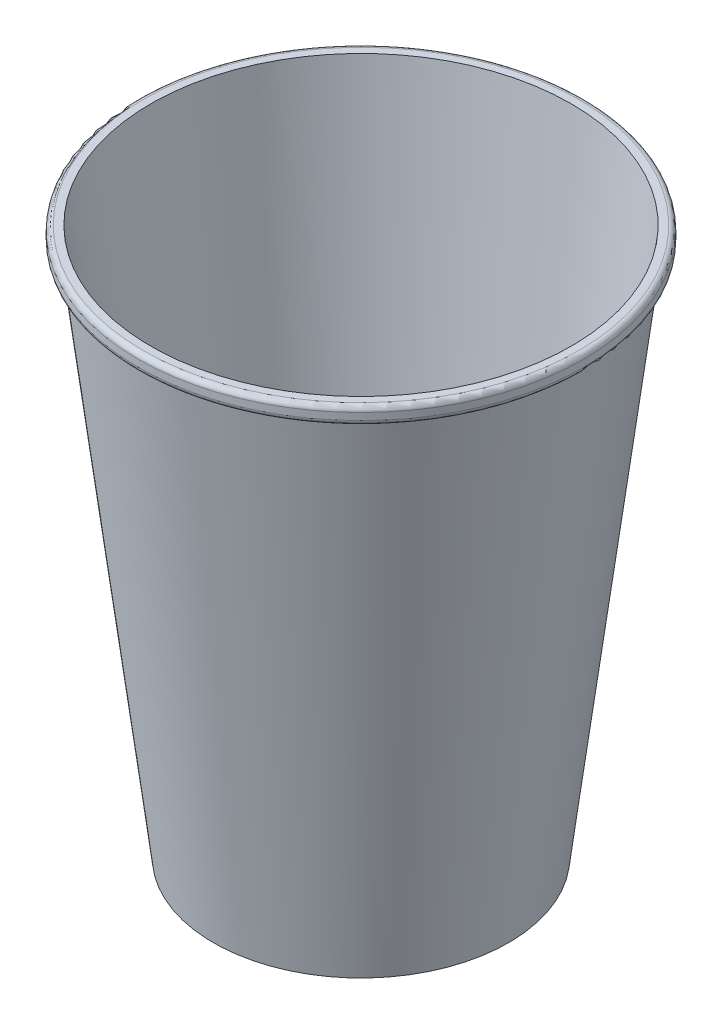
ISO-10303-21;
HEADER;
FILE_DESCRIPTION(('STEP AP214'),'2;1');
FILE_NAME('part.step','',(''),(''),'','','');
FILE_SCHEMA(('AUTOMOTIVE_DESIGN { 1 0 10303 214 1 1 1 1 }'));
ENDSEC;
DATA;
#1=APPLICATION_CONTEXT('core data for automotive mechanical design processes');
#2=APPLICATION_PROTOCOL_DEFINITION('international standard','automotive_design',2000,#1);
#3=PRODUCT_CONTEXT('',#1,'mechanical');
#4=PRODUCT('Part','Part','',(#3));
#5=PRODUCT_RELATED_PRODUCT_CATEGORY('part','',(#4));
#6=PRODUCT_DEFINITION_FORMATION('','',#4);
#7=PRODUCT_DEFINITION_CONTEXT('part definition',#1,'design');
#8=PRODUCT_DEFINITION('design','',#6,#7);
#9=PRODUCT_DEFINITION_SHAPE('','',#8);
#10=(LENGTH_UNIT() NAMED_UNIT(*) SI_UNIT(.MILLI.,.METRE.));
#11=(NAMED_UNIT(*) PLANE_ANGLE_UNIT() SI_UNIT($,.RADIAN.));
#12=(NAMED_UNIT(*) SI_UNIT($,.STERADIAN.) SOLID_ANGLE_UNIT());
#13=UNCERTAINTY_MEASURE_WITH_UNIT(LENGTH_MEASURE(1.E-05),#10,'distance_accuracy_value','');
#14=(GEOMETRIC_REPRESENTATION_CONTEXT(3) GLOBAL_UNCERTAINTY_ASSIGNED_CONTEXT((#13)) GLOBAL_UNIT_ASSIGNED_CONTEXT((#10,
#11,#12)) REPRESENTATION_CONTEXT('',''));
#15=CARTESIAN_POINT('',(0.,0.,0.));
#16=DIRECTION('',(0.,0.,1.));
#17=DIRECTION('',(1.,0.,0.));
#18=AXIS2_PLACEMENT_3D('',#15,#16,#17);
#19=CARTESIAN_POINT('',(29.5075712629279,0.,0.));
#20=DIRECTION('',(0.,-1.,0.));
#21=DIRECTION('',(0.,0.,-1.));
#22=AXIS2_PLACEMENT_3D('',#19,#20,#21);
#23=PLANE('',#22);
#24=CARTESIAN_POINT('',(0.,0.,0.));
#25=DIRECTION('',(0.,-1.,0.));
#26=DIRECTION('',(0.,0.,-1.));
#27=AXIS2_PLACEMENT_3D('',#24,#25,#26);
#28=CIRCLE('',#27,29.5075712629279);
#29=CARTESIAN_POINT('',(0.,0.,-29.5075712629279));
#30=VERTEX_POINT('',#29);
#31=EDGE_CURVE('E66',#30,#30,#28,.T.);
#32=ORIENTED_EDGE('',*,*,#31,.T.);
#33=EDGE_LOOP('',(#32));
#34=FACE_BOUND('',#33,.T.);
#35=CARTESIAN_POINT('',(0.,0.,0.));
#36=DIRECTION('',(0.,-1.,0.));
#37=DIRECTION('',(0.,0.,-1.));
#38=AXIS2_PLACEMENT_3D('',#35,#36,#37);
#39=CIRCLE('',#38,28.5);
#40=CARTESIAN_POINT('',(0.,0.,-28.5));
#41=VERTEX_POINT('',#40);
#42=EDGE_CURVE('E81',#41,#41,#39,.T.);
#43=ORIENTED_EDGE('',*,*,#42,.F.);
#44=EDGE_LOOP('',(#43));
#45=FACE_BOUND('',#44,.T.);
#46=ADVANCED_FACE('F50',(#34,#45),#23,.T.);
#47=CARTESIAN_POINT('',(0.,0.,0.));
#48=DIRECTION('',(0.,1.,0.));
#49=DIRECTION('',(0.,0.,1.));
#50=AXIS2_PLACEMENT_3D('',#47,#48,#49);
#51=CONICAL_SURFACE('',#50,29.5075712629279,0.122668655504457);
#52=CARTESIAN_POINT('',(0.,106.1,0.));
#53=DIRECTION('',(0.,-1.,0.));
#54=DIRECTION('',(0.,0.,-1.));
#55=AXIS2_PLACEMENT_3D('',#52,#53,#54);
#56=CIRCLE('',#55,42.5883931807361);
#57=CARTESIAN_POINT('',(0.,106.1,-42.5883931807361));
#58=VERTEX_POINT('',#57);
#59=EDGE_CURVE('E67',#58,#58,#56,.T.);
#60=ORIENTED_EDGE('',*,*,#59,.T.);
#61=EDGE_LOOP('',(#60));
#62=FACE_BOUND('',#61,.T.);
#63=ORIENTED_EDGE('',*,*,#31,.F.);
#64=EDGE_LOOP('',(#63));
#65=FACE_BOUND('',#64,.T.);
#66=ADVANCED_FACE('F89',(#62,#65),#51,.T.);
#67=CARTESIAN_POINT('',(42.5883931807361,106.1,0.));
#68=DIRECTION('',(0.,-1.,0.));
#69=DIRECTION('',(0.,0.,-1.));
#70=AXIS2_PLACEMENT_3D('',#67,#68,#69);
#71=PLANE('',#70);
#72=CARTESIAN_POINT('',(0.,106.1,0.));
#73=DIRECTION('',(0.,-1.,0.));
#74=DIRECTION('',(0.,0.,-1.));
#75=AXIS2_PLACEMENT_3D('',#72,#73,#74);
#76=CIRCLE('',#75,43.5);
#77=CARTESIAN_POINT('',(0.,106.1,-43.5));
#78=VERTEX_POINT('',#77);
#79=EDGE_CURVE('E65',#78,#78,#76,.T.);
#80=ORIENTED_EDGE('',*,*,#79,.T.);
#81=EDGE_LOOP('',(#80));
#82=FACE_BOUND('',#81,.T.);
#83=ORIENTED_EDGE('',*,*,#59,.F.);
#84=EDGE_LOOP('',(#83));
#85=FACE_BOUND('',#84,.T.);
#86=ADVANCED_FACE('F96',(#82,#85),#71,.T.);
#87=CARTESIAN_POINT('',(0.,0.,0.));
#88=DIRECTION('',(0.,-1.,0.));
#89=DIRECTION('',(0.,0.,-1.));
#90=AXIS2_PLACEMENT_3D('',#87,#88,#89);
#91=CYLINDRICAL_SURFACE('',#90,44.5);
#92=CARTESIAN_POINT('',(0.,107.1,0.));
#93=DIRECTION('',(0.,-1.,0.));
#94=DIRECTION('',(0.,0.,-1.));
#95=AXIS2_PLACEMENT_3D('',#92,#93,#94);
#96=CIRCLE('',#95,44.5);
#97=CARTESIAN_POINT('',(0.,107.1,-44.5));
#98=VERTEX_POINT('',#97);
#99=EDGE_CURVE('E53',#98,#98,#96,.F.);
#100=ORIENTED_EDGE('',*,*,#99,.T.);
#101=EDGE_LOOP('',(#100));
#102=FACE_BOUND('',#101,.T.);
#103=CARTESIAN_POINT('',(0.,108.5,0.));
#104=DIRECTION('',(0.,1.,0.));
#105=DIRECTION('',(0.,0.,1.));
#106=AXIS2_PLACEMENT_3D('',#103,#104,#105);
#107=CIRCLE('',#106,44.5);
#108=CARTESIAN_POINT('',(0.,108.5,44.5));
#109=VERTEX_POINT('',#108);
#110=EDGE_CURVE('E59',#109,#109,#107,.F.);
#111=ORIENTED_EDGE('',*,*,#110,.T.);
#112=EDGE_LOOP('',(#111));
#113=FACE_BOUND('',#112,.T.);
#114=ADVANCED_FACE('F118',(#102,#113),#91,.T.);
#115=CARTESIAN_POINT('',(42.,109.5,0.));
#116=DIRECTION('',(0.,1.,0.));
#117=DIRECTION('',(0.,0.,1.));
#118=AXIS2_PLACEMENT_3D('',#115,#116,#117);
#119=PLANE('',#118);
#120=CARTESIAN_POINT('',(0.,109.5,0.));
#121=DIRECTION('',(0.,1.,0.));
#122=DIRECTION('',(0.,0.,1.));
#123=AXIS2_PLACEMENT_3D('',#120,#121,#122);
#124=CIRCLE('',#123,43.5);
#125=CARTESIAN_POINT('',(0.,109.5,43.5));
#126=VERTEX_POINT('',#125);
#127=EDGE_CURVE('E10',#126,#126,#124,.T.);
#128=ORIENTED_EDGE('',*,*,#127,.T.);
#129=EDGE_LOOP('',(#128));
#130=FACE_BOUND('',#129,.T.);
#131=CARTESIAN_POINT('',(0.,109.5,0.));
#132=DIRECTION('',(0.,-1.,0.));
#133=DIRECTION('',(0.,0.,-1.));
#134=AXIS2_PLACEMENT_3D('',#131,#132,#133);
#135=CIRCLE('',#134,42.);
#136=CARTESIAN_POINT('',(0.,109.5,-42.));
#137=VERTEX_POINT('',#136);
#138=EDGE_CURVE('E71',#137,#137,#135,.T.);
#139=ORIENTED_EDGE('',*,*,#138,.T.);
#140=EDGE_LOOP('',(#139));
#141=FACE_BOUND('',#140,.T.);
#142=ADVANCED_FACE('F123',(#130,#141),#119,.T.);
#143=CARTESIAN_POINT('',(0.,109.5,0.));
#144=DIRECTION('',(0.,1.,0.));
#145=DIRECTION('',(0.,0.,1.));
#146=AXIS2_PLACEMENT_3D('',#143,#144,#145);
#147=CONICAL_SURFACE('',#146,42.,0.122668655504457);
#148=CARTESIAN_POINT('',(0.,7.5,0.));
#149=DIRECTION('',(0.,-1.,0.));
#150=DIRECTION('',(0.,0.,-1.));
#151=AXIS2_PLACEMENT_3D('',#148,#149,#150);
#152=CIRCLE('',#151,29.4246575342466);
#153=CARTESIAN_POINT('',(0.,7.5,-29.4246575342466));
#154=VERTEX_POINT('',#153);
#155=EDGE_CURVE('E78',#154,#154,#152,.T.);
#156=ORIENTED_EDGE('',*,*,#155,.T.);
#157=EDGE_LOOP('',(#156));
#158=FACE_BOUND('',#157,.T.);
#159=ORIENTED_EDGE('',*,*,#138,.F.);
#160=EDGE_LOOP('',(#159));
#161=FACE_BOUND('',#160,.T.);
#162=ADVANCED_FACE('F129',(#158,#161),#147,.F.);
#163=CARTESIAN_POINT('',(0.,7.5,0.));
#164=DIRECTION('',(0.,1.,0.));
#165=DIRECTION('',(0.,0.,1.));
#166=AXIS2_PLACEMENT_3D('',#163,#164,#165);
#167=PLANE('',#166);
#168=ORIENTED_EDGE('',*,*,#155,.F.);
#169=EDGE_LOOP('',(#168));
#170=FACE_BOUND('',#169,.T.);
#171=ADVANCED_FACE('F135',(#170),#167,.T.);
#172=CARTESIAN_POINT('',(29.3013698630137,6.5,0.));
#173=DIRECTION('',(0.,-1.,0.));
#174=DIRECTION('',(0.,0.,-1.));
#175=AXIS2_PLACEMENT_3D('',#172,#173,#174);
#176=PLANE('',#175);
#177=CARTESIAN_POINT('',(0.,6.5,0.));
#178=DIRECTION('',(0.,-1.,0.));
#179=DIRECTION('',(0.,0.,-1.));
#180=AXIS2_PLACEMENT_3D('',#177,#178,#179);
#181=CIRCLE('',#180,29.3013698630137);
#182=CARTESIAN_POINT('',(0.,6.5,-29.3013698630137));
#183=VERTEX_POINT('',#182);
#184=EDGE_CURVE('E79',#183,#183,#181,.T.);
#185=ORIENTED_EDGE('',*,*,#184,.T.);
#186=EDGE_LOOP('',(#185));
#187=FACE_BOUND('',#186,.T.);
#188=ADVANCED_FACE('F108',(#187),#176,.T.);
#189=CARTESIAN_POINT('',(0.,6.5,0.));
#190=DIRECTION('',(0.,1.,0.));
#191=DIRECTION('',(0.,0.,1.));
#192=AXIS2_PLACEMENT_3D('',#189,#190,#191);
#193=CONICAL_SURFACE('',#192,29.3013698630137,0.122668655504457);
#194=ORIENTED_EDGE('',*,*,#42,.T.);
#195=EDGE_LOOP('',(#194));
#196=FACE_BOUND('',#195,.T.);
#197=ORIENTED_EDGE('',*,*,#184,.F.);
#198=EDGE_LOOP('',(#197));
#199=FACE_BOUND('',#198,.T.);
#200=ADVANCED_FACE('F88',(#196,#199),#193,.F.);
#201=CARTESIAN_POINT('',(0.,107.1,0.));
#202=DIRECTION('',(0.,-1.,0.));
#203=DIRECTION('',(0.,0.,-1.));
#204=AXIS2_PLACEMENT_3D('',#201,#202,#203);
#205=TOROIDAL_SURFACE('',#204,43.5,1.);
#206=ORIENTED_EDGE('',*,*,#99,.F.);
#207=EDGE_LOOP('',(#206));
#208=FACE_BOUND('',#207,.T.);
#209=ORIENTED_EDGE('',*,*,#79,.F.);
#210=EDGE_LOOP('',(#209));
#211=FACE_BOUND('',#210,.T.);
#212=ADVANCED_FACE('F99',(#208,#211),#205,.T.);
#213=CARTESIAN_POINT('',(0.,108.5,0.));
#214=DIRECTION('',(0.,1.,0.));
#215=DIRECTION('',(0.,0.,1.));
#216=AXIS2_PLACEMENT_3D('',#213,#214,#215);
#217=TOROIDAL_SURFACE('',#216,43.5,1.);
#218=ORIENTED_EDGE('',*,*,#127,.F.);
#219=EDGE_LOOP('',(#218));
#220=FACE_BOUND('',#219,.T.);
#221=ORIENTED_EDGE('',*,*,#110,.F.);
#222=EDGE_LOOP('',(#221));
#223=FACE_BOUND('',#222,.T.);
#224=ADVANCED_FACE('F47',(#220,#223),#217,.T.);
#225=CLOSED_SHELL('',(#46,#66,#86,#114,#142,#162,#171,#188,#200,#212,#224));
#226=MANIFOLD_SOLID_BREP('B2',#225);
#227=ADVANCED_BREP_SHAPE_REPRESENTATION('',(#18,#226),#14);
#228=SHAPE_DEFINITION_REPRESENTATION(#9,#227);
ENDSEC;
END-ISO-10303-21;
